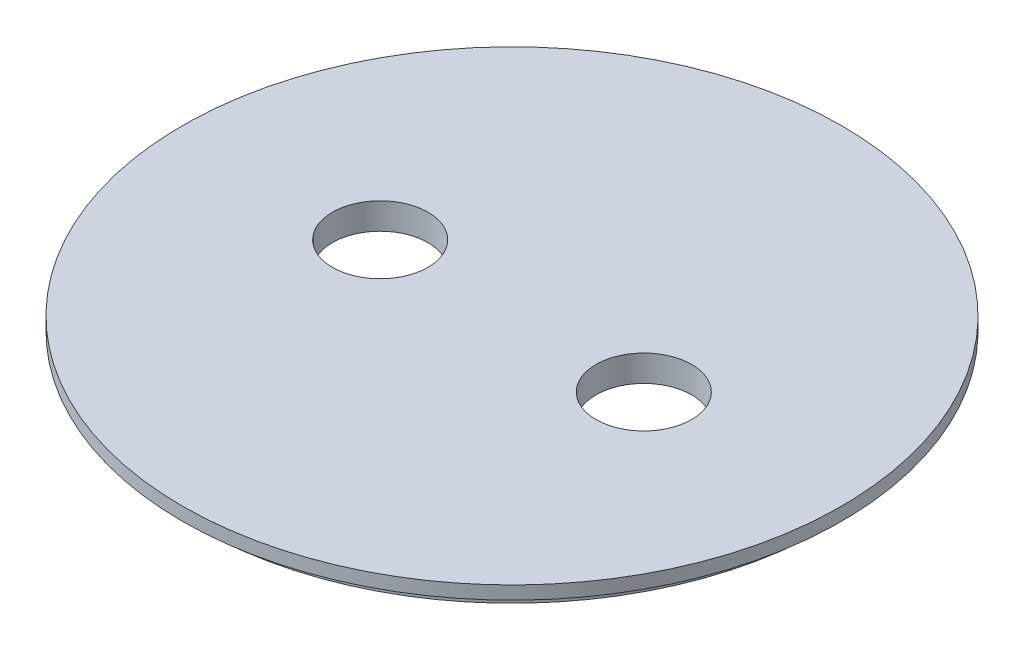
ISO-10303-21;
HEADER;
FILE_DESCRIPTION(('STEP AP214'),'2;1');
FILE_NAME('part.step','',(''),(''),'','','');
FILE_SCHEMA(('AUTOMOTIVE_DESIGN { 1 0 10303 214 1 1 1 1 }'));
ENDSEC;
DATA;
#1=APPLICATION_CONTEXT('core data for automotive mechanical design processes');
#2=APPLICATION_PROTOCOL_DEFINITION('international standard','automotive_design',2000,#1);
#3=PRODUCT_CONTEXT('',#1,'mechanical');
#4=PRODUCT('Part','Part','',(#3));
#5=PRODUCT_RELATED_PRODUCT_CATEGORY('part','',(#4));
#6=PRODUCT_DEFINITION_FORMATION('','',#4);
#7=PRODUCT_DEFINITION_CONTEXT('part definition',#1,'design');
#8=PRODUCT_DEFINITION('design','',#6,#7);
#9=PRODUCT_DEFINITION_SHAPE('','',#8);
#10=(LENGTH_UNIT() NAMED_UNIT(*) SI_UNIT(.MILLI.,.METRE.));
#11=(NAMED_UNIT(*) PLANE_ANGLE_UNIT() SI_UNIT($,.RADIAN.));
#12=(NAMED_UNIT(*) SI_UNIT($,.STERADIAN.) SOLID_ANGLE_UNIT());
#13=UNCERTAINTY_MEASURE_WITH_UNIT(LENGTH_MEASURE(1.E-05),#10,'distance_accuracy_value','');
#14=(GEOMETRIC_REPRESENTATION_CONTEXT(3) GLOBAL_UNCERTAINTY_ASSIGNED_CONTEXT((#13)) GLOBAL_UNIT_ASSIGNED_CONTEXT((#10,
#11,#12)) REPRESENTATION_CONTEXT('',''));
#15=CARTESIAN_POINT('',(0.,0.,0.));
#16=DIRECTION('',(0.,0.,1.));
#17=DIRECTION('',(1.,0.,0.));
#18=AXIS2_PLACEMENT_3D('',#15,#16,#17);
#19=CARTESIAN_POINT('',(0.,2.,0.));
#20=DIRECTION('',(0.,-1.,0.));
#21=DIRECTION('',(0.,0.,-1.));
#22=AXIS2_PLACEMENT_3D('',#19,#20,#21);
#23=CYLINDRICAL_SURFACE('',#22,50.);
#24=CARTESIAN_POINT('',(0.,2.,0.));
#25=DIRECTION('',(0.,1.,0.));
#26=DIRECTION('',(0.,0.,1.));
#27=AXIS2_PLACEMENT_3D('',#24,#25,#26);
#28=CIRCLE('',#27,50.);
#29=CARTESIAN_POINT('',(0.,2.,50.));
#30=VERTEX_POINT('',#29);
#31=EDGE_CURVE('E42',#30,#30,#28,.T.);
#32=ORIENTED_EDGE('',*,*,#31,.F.);
#33=EDGE_LOOP('',(#32));
#34=FACE_BOUND('',#33,.T.);
#35=CARTESIAN_POINT('',(0.,0.,0.));
#36=DIRECTION('',(0.,1.,0.));
#37=DIRECTION('',(0.,0.,1.));
#38=AXIS2_PLACEMENT_3D('',#35,#36,#37);
#39=CIRCLE('',#38,50.);
#40=CARTESIAN_POINT('',(0.,0.,50.));
#41=VERTEX_POINT('',#40);
#42=EDGE_CURVE('E38',#41,#41,#39,.T.);
#43=ORIENTED_EDGE('',*,*,#42,.T.);
#44=EDGE_LOOP('',(#43));
#45=FACE_BOUND('',#44,.T.);
#46=ADVANCED_FACE('F35',(#34,#45),#23,.T.);
#47=CARTESIAN_POINT('',(0.,2.,0.));
#48=DIRECTION('',(0.,1.,0.));
#49=DIRECTION('',(0.,0.,1.));
#50=AXIS2_PLACEMENT_3D('',#47,#48,#49);
#51=PLANE('',#50);
#52=CARTESIAN_POINT('',(20.,2.,0.));
#53=DIRECTION('',(0.,1.,0.));
#54=DIRECTION('',(0.,0.,1.));
#55=AXIS2_PLACEMENT_3D('',#52,#53,#54);
#56=CIRCLE('',#55,7.25);
#57=CARTESIAN_POINT('',(20.,2.,7.25));
#58=VERTEX_POINT('',#57);
#59=EDGE_CURVE('E58',#58,#58,#56,.T.);
#60=ORIENTED_EDGE('',*,*,#59,.F.);
#61=EDGE_LOOP('',(#60));
#62=FACE_BOUND('',#61,.T.);
#63=CARTESIAN_POINT('',(-20.,2.,0.));
#64=DIRECTION('',(0.,1.,0.));
#65=DIRECTION('',(0.,0.,1.));
#66=AXIS2_PLACEMENT_3D('',#63,#64,#65);
#67=CIRCLE('',#66,7.25);
#68=CARTESIAN_POINT('',(-20.,2.,7.24999999999999));
#69=VERTEX_POINT('',#68);
#70=EDGE_CURVE('E55',#69,#69,#67,.T.);
#71=ORIENTED_EDGE('',*,*,#70,.F.);
#72=EDGE_LOOP('',(#71));
#73=FACE_BOUND('',#72,.T.);
#74=ORIENTED_EDGE('',*,*,#31,.T.);
#75=EDGE_LOOP('',(#74));
#76=FACE_BOUND('',#75,.T.);
#77=ADVANCED_FACE('F74',(#62,#73,#76),#51,.T.);
#78=CARTESIAN_POINT('',(0.,0.,0.));
#79=DIRECTION('',(0.,1.,0.));
#80=DIRECTION('',(0.,0.,1.));
#81=AXIS2_PLACEMENT_3D('',#78,#79,#80);
#82=PLANE('',#81);
#83=CARTESIAN_POINT('',(0.,0.,0.));
#84=DIRECTION('',(0.,-1.,0.));
#85=DIRECTION('',(0.,0.,-1.));
#86=AXIS2_PLACEMENT_3D('',#83,#84,#85);
#87=CIRCLE('',#86,47.75);
#88=CARTESIAN_POINT('',(0.,0.,-47.75));
#89=VERTEX_POINT('',#88);
#90=EDGE_CURVE('E10',#89,#89,#87,.T.);
#91=ORIENTED_EDGE('',*,*,#90,.F.);
#92=EDGE_LOOP('',(#91));
#93=FACE_BOUND('',#92,.T.);
#94=ORIENTED_EDGE('',*,*,#42,.F.);
#95=EDGE_LOOP('',(#94));
#96=FACE_BOUND('',#95,.T.);
#97=ADVANCED_FACE('F77',(#93,#96),#82,.F.);
#98=CARTESIAN_POINT('',(0.,-2.,0.));
#99=DIRECTION('',(0.,1.,0.));
#100=DIRECTION('',(0.,0.,1.));
#101=AXIS2_PLACEMENT_3D('',#98,#99,#100);
#102=CYLINDRICAL_SURFACE('',#101,47.75);
#103=CARTESIAN_POINT('',(0.,-2.,0.));
#104=DIRECTION('',(0.,-1.,0.));
#105=DIRECTION('',(0.,0.,-1.));
#106=AXIS2_PLACEMENT_3D('',#103,#104,#105);
#107=CIRCLE('',#106,47.75);
#108=CARTESIAN_POINT('',(0.,-2.,-47.75));
#109=VERTEX_POINT('',#108);
#110=EDGE_CURVE('E48',#109,#109,#107,.T.);
#111=ORIENTED_EDGE('',*,*,#110,.F.);
#112=EDGE_LOOP('',(#111));
#113=FACE_BOUND('',#112,.T.);
#114=ORIENTED_EDGE('',*,*,#90,.T.);
#115=EDGE_LOOP('',(#114));
#116=FACE_BOUND('',#115,.T.);
#117=ADVANCED_FACE('F89',(#113,#116),#102,.T.);
#118=CARTESIAN_POINT('',(0.,-2.,0.));
#119=DIRECTION('',(0.,-1.,0.));
#120=DIRECTION('',(0.,0.,-1.));
#121=AXIS2_PLACEMENT_3D('',#118,#119,#120);
#122=PLANE('',#121);
#123=CARTESIAN_POINT('',(20.,-2.,0.));
#124=DIRECTION('',(0.,1.,0.));
#125=DIRECTION('',(0.,0.,1.));
#126=AXIS2_PLACEMENT_3D('',#123,#124,#125);
#127=CIRCLE('',#126,7.25);
#128=CARTESIAN_POINT('',(20.,-2.,7.25));
#129=VERTEX_POINT('',#128);
#130=EDGE_CURVE('E51',#129,#129,#127,.T.);
#131=ORIENTED_EDGE('',*,*,#130,.T.);
#132=EDGE_LOOP('',(#131));
#133=FACE_BOUND('',#132,.T.);
#134=CARTESIAN_POINT('',(-20.,-2.,0.));
#135=DIRECTION('',(0.,1.,0.));
#136=DIRECTION('',(0.,0.,1.));
#137=AXIS2_PLACEMENT_3D('',#134,#135,#136);
#138=CIRCLE('',#137,7.25);
#139=CARTESIAN_POINT('',(-20.,-2.,7.24999999999999));
#140=VERTEX_POINT('',#139);
#141=EDGE_CURVE('E52',#140,#140,#138,.T.);
#142=ORIENTED_EDGE('',*,*,#141,.T.);
#143=EDGE_LOOP('',(#142));
#144=FACE_BOUND('',#143,.T.);
#145=ORIENTED_EDGE('',*,*,#110,.T.);
#146=EDGE_LOOP('',(#145));
#147=FACE_BOUND('',#146,.T.);
#148=ADVANCED_FACE('F64',(#133,#144,#147),#122,.T.);
#149=CARTESIAN_POINT('',(-20.,-2.,0.));
#150=DIRECTION('',(0.,1.,0.));
#151=DIRECTION('',(0.,0.,1.));
#152=AXIS2_PLACEMENT_3D('',#149,#150,#151);
#153=CYLINDRICAL_SURFACE('',#152,7.25);
#154=ORIENTED_EDGE('',*,*,#141,.F.);
#155=EDGE_LOOP('',(#154));
#156=FACE_BOUND('',#155,.T.);
#157=ORIENTED_EDGE('',*,*,#70,.T.);
#158=EDGE_LOOP('',(#157));
#159=FACE_BOUND('',#158,.T.);
#160=ADVANCED_FACE('F70',(#156,#159),#153,.F.);
#161=CARTESIAN_POINT('',(20.,-2.,0.));
#162=DIRECTION('',(0.,1.,0.));
#163=DIRECTION('',(0.,0.,1.));
#164=AXIS2_PLACEMENT_3D('',#161,#162,#163);
#165=CYLINDRICAL_SURFACE('',#164,7.25);
#166=ORIENTED_EDGE('',*,*,#130,.F.);
#167=EDGE_LOOP('',(#166));
#168=FACE_BOUND('',#167,.T.);
#169=ORIENTED_EDGE('',*,*,#59,.T.);
#170=EDGE_LOOP('',(#169));
#171=FACE_BOUND('',#170,.T.);
#172=ADVANCED_FACE('F67',(#168,#171),#165,.F.);
#173=CLOSED_SHELL('',(#46,#77,#97,#117,#148,#160,#172));
#174=MANIFOLD_SOLID_BREP('B2',#173);
#175=ADVANCED_BREP_SHAPE_REPRESENTATION('',(#18,#174),#14);
#176=SHAPE_DEFINITION_REPRESENTATION(#9,#175);
ENDSEC;
END-ISO-10303-21;
